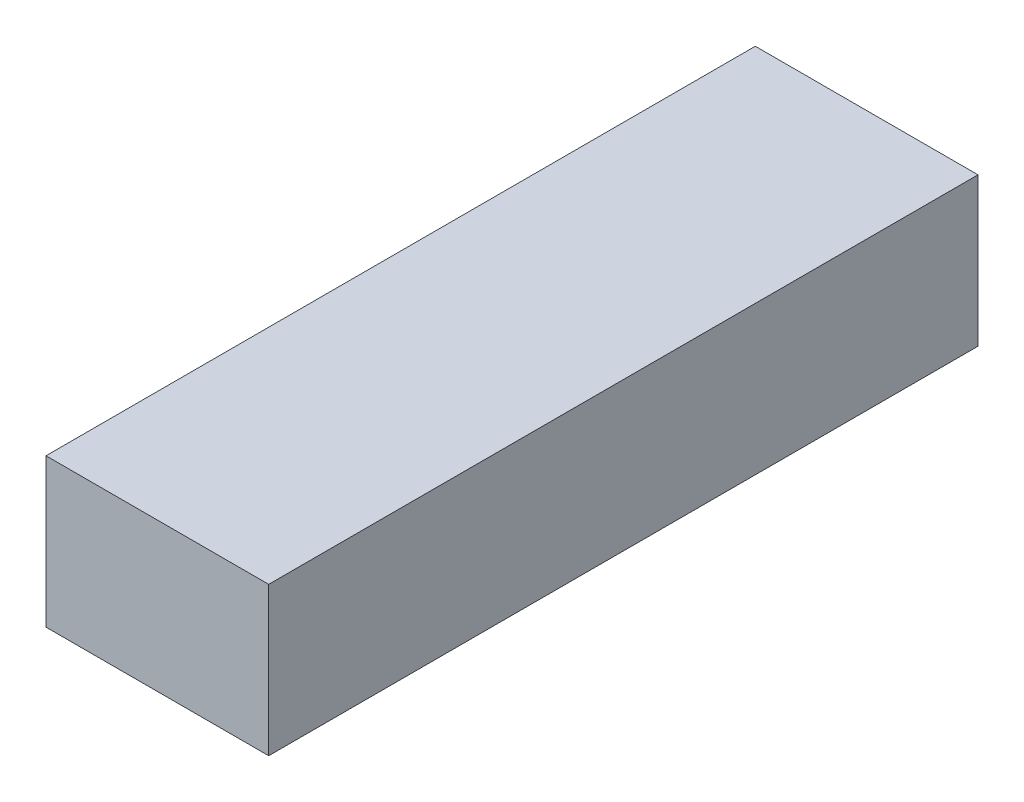
ISO-10303-21;
HEADER;
FILE_DESCRIPTION(('STEP AP214'),'2;1');
FILE_NAME('part.step','',(''),(''),'','','');
FILE_SCHEMA(('AUTOMOTIVE_DESIGN { 1 0 10303 214 1 1 1 1 }'));
ENDSEC;
DATA;
#1=APPLICATION_CONTEXT('core data for automotive mechanical design processes');
#2=APPLICATION_PROTOCOL_DEFINITION('international standard','automotive_design',2000,#1);
#3=PRODUCT_CONTEXT('',#1,'mechanical');
#4=PRODUCT('Part','Part','',(#3));
#5=PRODUCT_RELATED_PRODUCT_CATEGORY('part','',(#4));
#6=PRODUCT_DEFINITION_FORMATION('','',#4);
#7=PRODUCT_DEFINITION_CONTEXT('part definition',#1,'design');
#8=PRODUCT_DEFINITION('design','',#6,#7);
#9=PRODUCT_DEFINITION_SHAPE('','',#8);
#10=(LENGTH_UNIT() NAMED_UNIT(*) SI_UNIT(.MILLI.,.METRE.));
#11=(NAMED_UNIT(*) PLANE_ANGLE_UNIT() SI_UNIT($,.RADIAN.));
#12=(NAMED_UNIT(*) SI_UNIT($,.STERADIAN.) SOLID_ANGLE_UNIT());
#13=UNCERTAINTY_MEASURE_WITH_UNIT(LENGTH_MEASURE(1.E-05),#10,'distance_accuracy_value','');
#14=(GEOMETRIC_REPRESENTATION_CONTEXT(3) GLOBAL_UNCERTAINTY_ASSIGNED_CONTEXT((#13)) GLOBAL_UNIT_ASSIGNED_CONTEXT((#10,
#11,#12)) REPRESENTATION_CONTEXT('',''));
#15=CARTESIAN_POINT('',(0.,0.,0.));
#16=DIRECTION('',(0.,0.,1.));
#17=DIRECTION('',(1.,0.,0.));
#18=AXIS2_PLACEMENT_3D('',#15,#16,#17);
#19=CARTESIAN_POINT('',(21.43125,-14.2875,68.2625));
#20=DIRECTION('',(-1.,0.,0.));
#21=DIRECTION('',(0.,0.,1.));
#22=AXIS2_PLACEMENT_3D('',#19,#20,#21);
#23=PLANE('',#22);
#24=DIRECTION('',(0.,1.,0.));
#25=VECTOR('',#24,1.);
#26=CARTESIAN_POINT('',(21.43125,-14.2875,-68.2625));
#27=LINE('',#26,#25);
#28=CARTESIAN_POINT('',(21.43125,-14.2875,-68.2625));
#29=VERTEX_POINT('',#28);
#30=CARTESIAN_POINT('',(21.43125,14.2875,-68.2625));
#31=VERTEX_POINT('',#30);
#32=EDGE_CURVE('E96',#29,#31,#27,.T.);
#33=ORIENTED_EDGE('',*,*,#32,.T.);
#34=DIRECTION('',(0.,0.,-1.));
#35=VECTOR('',#34,1.);
#36=CARTESIAN_POINT('',(21.43125,14.2875,68.2625));
#37=LINE('',#36,#35);
#38=CARTESIAN_POINT('',(21.43125,14.2875,68.2625));
#39=VERTEX_POINT('',#38);
#40=EDGE_CURVE('E11',#39,#31,#37,.T.);
#41=ORIENTED_EDGE('',*,*,#40,.F.);
#42=DIRECTION('',(0.,1.,0.));
#43=VECTOR('',#42,1.);
#44=CARTESIAN_POINT('',(21.43125,-14.2875,68.2625));
#45=LINE('',#44,#43);
#46=CARTESIAN_POINT('',(21.43125,-14.2875,68.2625));
#47=VERTEX_POINT('',#46);
#48=EDGE_CURVE('E84',#47,#39,#45,.T.);
#49=ORIENTED_EDGE('',*,*,#48,.F.);
#50=DIRECTION('',(0.,0.,-1.));
#51=VECTOR('',#50,1.);
#52=CARTESIAN_POINT('',(21.43125,-14.2875,68.2625));
#53=LINE('',#52,#51);
#54=EDGE_CURVE('E92',#47,#29,#53,.T.);
#55=ORIENTED_EDGE('',*,*,#54,.T.);
#56=EDGE_LOOP('',(#33,#41,#49,#55));
#57=FACE_BOUND('',#56,.T.);
#58=ADVANCED_FACE('F33',(#57),#23,.F.);
#59=CARTESIAN_POINT('',(-21.43125,14.2875,68.2625));
#60=DIRECTION('',(0.,-1.,0.));
#61=DIRECTION('',(0.,0.,-1.));
#62=AXIS2_PLACEMENT_3D('',#59,#60,#61);
#63=PLANE('',#62);
#64=DIRECTION('',(-1.,0.,0.));
#65=VECTOR('',#64,1.);
#66=CARTESIAN_POINT('',(-21.43125,14.2875,-68.2625));
#67=LINE('',#66,#65);
#68=CARTESIAN_POINT('',(-21.43125,14.2875,-68.2625));
#69=VERTEX_POINT('',#68);
#70=EDGE_CURVE('E88',#31,#69,#67,.T.);
#71=ORIENTED_EDGE('',*,*,#70,.T.);
#72=DIRECTION('',(0.,0.,-1.));
#73=VECTOR('',#72,1.);
#74=CARTESIAN_POINT('',(-21.43125,14.2875,68.2625));
#75=LINE('',#74,#73);
#76=CARTESIAN_POINT('',(-21.43125,14.2875,68.2625));
#77=VERTEX_POINT('',#76);
#78=EDGE_CURVE('E41',#77,#69,#75,.T.);
#79=ORIENTED_EDGE('',*,*,#78,.F.);
#80=DIRECTION('',(-1.,0.,0.));
#81=VECTOR('',#80,1.);
#82=CARTESIAN_POINT('',(-21.43125,14.2875,68.2625));
#83=LINE('',#82,#81);
#84=EDGE_CURVE('E79',#39,#77,#83,.T.);
#85=ORIENTED_EDGE('',*,*,#84,.F.);
#86=ORIENTED_EDGE('',*,*,#40,.T.);
#87=EDGE_LOOP('',(#71,#79,#85,#86));
#88=FACE_BOUND('',#87,.T.);
#89=ADVANCED_FACE('F87',(#88),#63,.F.);
#90=CARTESIAN_POINT('',(-21.43125,-14.2875,68.2625));
#91=DIRECTION('',(1.,0.,0.));
#92=DIRECTION('',(0.,0.,-1.));
#93=AXIS2_PLACEMENT_3D('',#90,#91,#92);
#94=PLANE('',#93);
#95=DIRECTION('',(0.,-1.,0.));
#96=VECTOR('',#95,1.);
#97=CARTESIAN_POINT('',(-21.43125,-14.2875,-68.2625));
#98=LINE('',#97,#96);
#99=CARTESIAN_POINT('',(-21.43125,-14.2875,-68.2625));
#100=VERTEX_POINT('',#99);
#101=EDGE_CURVE('E66',#69,#100,#98,.T.);
#102=ORIENTED_EDGE('',*,*,#101,.T.);
#103=DIRECTION('',(0.,0.,-1.));
#104=VECTOR('',#103,1.);
#105=CARTESIAN_POINT('',(-21.43125,-14.2875,68.2625));
#106=LINE('',#105,#104);
#107=CARTESIAN_POINT('',(-21.43125,-14.2875,68.2625));
#108=VERTEX_POINT('',#107);
#109=EDGE_CURVE('E89',#108,#100,#106,.T.);
#110=ORIENTED_EDGE('',*,*,#109,.F.);
#111=DIRECTION('',(0.,-1.,0.));
#112=VECTOR('',#111,1.);
#113=CARTESIAN_POINT('',(-21.43125,-14.2875,68.2625));
#114=LINE('',#113,#112);
#115=EDGE_CURVE('E82',#77,#108,#114,.T.);
#116=ORIENTED_EDGE('',*,*,#115,.F.);
#117=ORIENTED_EDGE('',*,*,#78,.T.);
#118=EDGE_LOOP('',(#102,#110,#116,#117));
#119=FACE_BOUND('',#118,.T.);
#120=ADVANCED_FACE('F90',(#119),#94,.F.);
#121=CARTESIAN_POINT('',(-21.43125,-14.2875,68.2625));
#122=DIRECTION('',(0.,1.,0.));
#123=DIRECTION('',(0.,0.,1.));
#124=AXIS2_PLACEMENT_3D('',#121,#122,#123);
#125=PLANE('',#124);
#126=DIRECTION('',(1.,0.,0.));
#127=VECTOR('',#126,1.);
#128=CARTESIAN_POINT('',(-21.43125,-14.2875,-68.2625));
#129=LINE('',#128,#127);
#130=EDGE_CURVE('E72',#100,#29,#129,.T.);
#131=ORIENTED_EDGE('',*,*,#130,.T.);
#132=ORIENTED_EDGE('',*,*,#54,.F.);
#133=DIRECTION('',(1.,0.,0.));
#134=VECTOR('',#133,1.);
#135=CARTESIAN_POINT('',(-21.43125,-14.2875,68.2625));
#136=LINE('',#135,#134);
#137=EDGE_CURVE('E49',#108,#47,#136,.T.);
#138=ORIENTED_EDGE('',*,*,#137,.F.);
#139=ORIENTED_EDGE('',*,*,#109,.T.);
#140=EDGE_LOOP('',(#131,#132,#138,#139));
#141=FACE_BOUND('',#140,.T.);
#142=ADVANCED_FACE('F103',(#141),#125,.F.);
#143=CARTESIAN_POINT('',(0.,0.,68.2625));
#144=DIRECTION('',(0.,0.,-1.));
#145=DIRECTION('',(-1.,0.,0.));
#146=AXIS2_PLACEMENT_3D('',#143,#144,#145);
#147=PLANE('',#146);
#148=ORIENTED_EDGE('',*,*,#48,.T.);
#149=ORIENTED_EDGE('',*,*,#84,.T.);
#150=ORIENTED_EDGE('',*,*,#115,.T.);
#151=ORIENTED_EDGE('',*,*,#137,.T.);
#152=EDGE_LOOP('',(#148,#149,#150,#151));
#153=FACE_BOUND('',#152,.T.);
#154=ADVANCED_FACE('F80',(#153),#147,.F.);
#155=CARTESIAN_POINT('',(0.,0.,-68.2625));
#156=DIRECTION('',(0.,0.,-1.));
#157=DIRECTION('',(-1.,0.,0.));
#158=AXIS2_PLACEMENT_3D('',#155,#156,#157);
#159=PLANE('',#158);
#160=ORIENTED_EDGE('',*,*,#32,.F.);
#161=ORIENTED_EDGE('',*,*,#130,.F.);
#162=ORIENTED_EDGE('',*,*,#101,.F.);
#163=ORIENTED_EDGE('',*,*,#70,.F.);
#164=EDGE_LOOP('',(#160,#161,#162,#163));
#165=FACE_BOUND('',#164,.T.);
#166=ADVANCED_FACE('F106',(#165),#159,.T.);
#167=CLOSED_SHELL('',(#58,#89,#120,#142,#154,#166));
#168=MANIFOLD_SOLID_BREP('B2',#167);
#169=ADVANCED_BREP_SHAPE_REPRESENTATION('',(#18,#168),#14);
#170=SHAPE_DEFINITION_REPRESENTATION(#9,#169);
ENDSEC;
END-ISO-10303-21;
